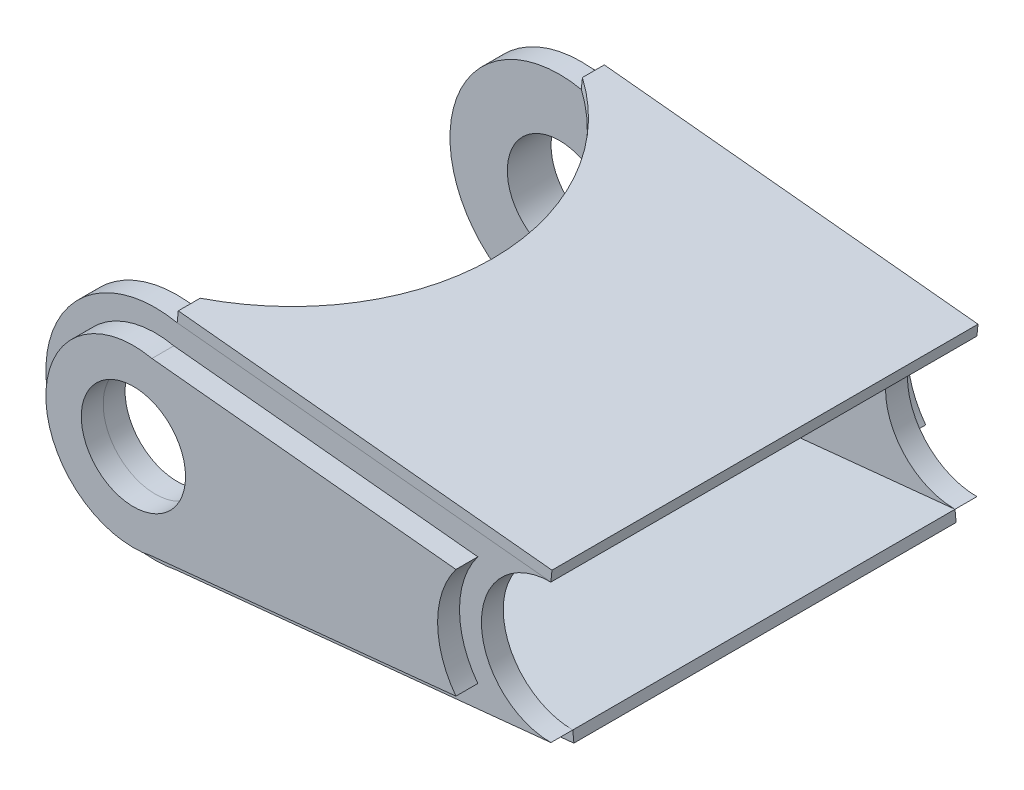
ISO-10303-21;
HEADER;
FILE_DESCRIPTION(('STEP AP214'),'2;1');
FILE_NAME('part.step','',(''),(''),'','','');
FILE_SCHEMA(('AUTOMOTIVE_DESIGN { 1 0 10303 214 1 1 1 1 }'));
ENDSEC;
DATA;
#1=APPLICATION_CONTEXT('core data for automotive mechanical design processes');
#2=APPLICATION_PROTOCOL_DEFINITION('international standard','automotive_design',2000,#1);
#3=PRODUCT_CONTEXT('',#1,'mechanical');
#4=PRODUCT('Part','Part','',(#3));
#5=PRODUCT_RELATED_PRODUCT_CATEGORY('part','',(#4));
#6=PRODUCT_DEFINITION_FORMATION('','',#4);
#7=PRODUCT_DEFINITION_CONTEXT('part definition',#1,'design');
#8=PRODUCT_DEFINITION('design','',#6,#7);
#9=PRODUCT_DEFINITION_SHAPE('','',#8);
#10=(LENGTH_UNIT() NAMED_UNIT(*) SI_UNIT(.MILLI.,.METRE.));
#11=(NAMED_UNIT(*) PLANE_ANGLE_UNIT() SI_UNIT($,.RADIAN.));
#12=(NAMED_UNIT(*) SI_UNIT($,.STERADIAN.) SOLID_ANGLE_UNIT());
#13=UNCERTAINTY_MEASURE_WITH_UNIT(LENGTH_MEASURE(1.E-05),#10,'distance_accuracy_value','');
#14=(GEOMETRIC_REPRESENTATION_CONTEXT(3) GLOBAL_UNCERTAINTY_ASSIGNED_CONTEXT((#13)) GLOBAL_UNIT_ASSIGNED_CONTEXT((#10,
#11,#12)) REPRESENTATION_CONTEXT('',''));
#15=CARTESIAN_POINT('',(0.,0.,0.));
#16=DIRECTION('',(0.,0.,1.));
#17=DIRECTION('',(1.,0.,0.));
#18=AXIS2_PLACEMENT_3D('',#15,#16,#17);
#19=CARTESIAN_POINT('',(-91.2989739584513,-23.9300487696169,0.));
#20=DIRECTION('',(-0.100474520026306,0.994939631749326,0.));
#21=DIRECTION('',(-0.994939631749326,-0.100474520026306,0.));
#22=AXIS2_PLACEMENT_3D('',#19,#20,#21);
#23=CYLINDRICAL_SURFACE('',#22,42.);
#24=CARTESIAN_POINT('',(-91.4999229985039,-21.9401695061182,0.));
#25=DIRECTION('',(-0.100474520026306,0.994939631749326,0.));
#26=DIRECTION('',(-0.994939631749326,-0.100474520026306,0.));
#27=AXIS2_PLACEMENT_3D('',#24,#25,#26);
#28=CIRCLE('',#27,42.);
#29=CARTESIAN_POINT('',(-68.2889308238494,-19.5961948330193,34.925));
#30=VERTEX_POINT('',#29);
#31=CARTESIAN_POINT('',(-68.2889308238494,-19.5961948330193,-34.925));
#32=VERTEX_POINT('',#31);
#33=EDGE_CURVE('E111',#30,#32,#28,.T.);
#34=ORIENTED_EDGE('',*,*,#33,.T.);
#35=DIRECTION('',(-0.100474520026306,0.994939631749326,0.));
#36=VECTOR('',#35,1.);
#37=CARTESIAN_POINT('',(-68.0879817837968,-21.586074096518,-34.925));
#38=LINE('',#37,#36);
#39=CARTESIAN_POINT('',(-68.0879817837968,-21.586074096518,-34.925));
#40=VERTEX_POINT('',#39);
#41=EDGE_CURVE('E12',#40,#32,#38,.T.);
#42=ORIENTED_EDGE('',*,*,#41,.F.);
#43=CARTESIAN_POINT('',(-91.2989739584513,-23.9300487696169,0.));
#44=DIRECTION('',(-0.100474520026306,0.994939631749326,0.));
#45=DIRECTION('',(-0.994939631749326,-0.100474520026306,0.));
#46=AXIS2_PLACEMENT_3D('',#43,#44,#45);
#47=CIRCLE('',#46,42.);
#48=CARTESIAN_POINT('',(-68.0879817837968,-21.586074096518,34.925));
#49=VERTEX_POINT('',#48);
#50=EDGE_CURVE('E99',#49,#40,#47,.T.);
#51=ORIENTED_EDGE('',*,*,#50,.F.);
#52=DIRECTION('',(-0.100474520026306,0.994939631749326,0.));
#53=VECTOR('',#52,1.);
#54=CARTESIAN_POINT('',(-68.0879817837968,-21.586074096518,34.925));
#55=LINE('',#54,#53);
#56=EDGE_CURVE('E107',#49,#30,#55,.T.);
#57=ORIENTED_EDGE('',*,*,#56,.T.);
#58=EDGE_LOOP('',(#34,#42,#51,#57));
#59=FACE_BOUND('',#58,.T.);
#60=ADVANCED_FACE('F48',(#59),#23,.F.);
#61=CARTESIAN_POINT('',(-68.0879817837968,-21.586074096518,-34.925));
#62=DIRECTION('',(0.,0.,1.));
#63=DIRECTION('',(1.,0.,0.));
#64=AXIS2_PLACEMENT_3D('',#61,#62,#63);
#65=PLANE('',#64);
#66=DIRECTION('',(0.994939631749325,0.100474520026306,0.));
#67=VECTOR('',#66,1.);
#68=CARTESIAN_POINT('',(-68.2889308238494,-19.5961948330193,-34.925));
#69=LINE('',#68,#67);
#70=CARTESIAN_POINT('',(0.,-12.7,-34.925));
#71=VERTEX_POINT('',#70);
#72=EDGE_CURVE('E103',#32,#71,#69,.T.);
#73=ORIENTED_EDGE('',*,*,#72,.T.);
#74=DIRECTION('',(-0.100474520026306,0.994939631749326,0.));
#75=VECTOR('',#74,1.);
#76=CARTESIAN_POINT('',(0.200949040052612,-14.6898792634987,-34.925));
#77=LINE('',#76,#75);
#78=CARTESIAN_POINT('',(0.200949040052612,-14.6898792634987,-34.925));
#79=VERTEX_POINT('',#78);
#80=EDGE_CURVE('E56',#79,#71,#77,.T.);
#81=ORIENTED_EDGE('',*,*,#80,.F.);
#82=DIRECTION('',(0.994939631749325,0.100474520026306,0.));
#83=VECTOR('',#82,1.);
#84=CARTESIAN_POINT('',(-68.0879817837968,-21.586074096518,-34.925));
#85=LINE('',#84,#83);
#86=EDGE_CURVE('E94',#40,#79,#85,.T.);
#87=ORIENTED_EDGE('',*,*,#86,.F.);
#88=ORIENTED_EDGE('',*,*,#41,.T.);
#89=EDGE_LOOP('',(#73,#81,#87,#88));
#90=FACE_BOUND('',#89,.T.);
#91=ADVANCED_FACE('F102',(#90),#65,.F.);
#92=CARTESIAN_POINT('',(0.200949040052612,-14.6898792634987,-34.925));
#93=DIRECTION('',(-0.994939631749326,-0.100474520026306,0.));
#94=DIRECTION('',(0.100474520026306,-0.994939631749326,0.));
#95=AXIS2_PLACEMENT_3D('',#92,#93,#94);
#96=PLANE('',#95);
#97=DIRECTION('',(0.,0.,1.));
#98=VECTOR('',#97,1.);
#99=CARTESIAN_POINT('',(0.,-12.7,-34.925));
#100=LINE('',#99,#98);
#101=CARTESIAN_POINT('',(0.,-12.7,34.925));
#102=VERTEX_POINT('',#101);
#103=EDGE_CURVE('E81',#71,#102,#100,.T.);
#104=ORIENTED_EDGE('',*,*,#103,.T.);
#105=DIRECTION('',(-0.100474520026306,0.994939631749326,0.));
#106=VECTOR('',#105,1.);
#107=CARTESIAN_POINT('',(0.200949040052612,-14.6898792634987,34.925));
#108=LINE('',#107,#106);
#109=CARTESIAN_POINT('',(0.200949040052612,-14.6898792634987,34.925));
#110=VERTEX_POINT('',#109);
#111=EDGE_CURVE('E104',#110,#102,#108,.T.);
#112=ORIENTED_EDGE('',*,*,#111,.F.);
#113=DIRECTION('',(0.,0.,1.));
#114=VECTOR('',#113,1.);
#115=CARTESIAN_POINT('',(0.200949040052612,-14.6898792634987,-34.925));
#116=LINE('',#115,#114);
#117=EDGE_CURVE('E97',#79,#110,#116,.T.);
#118=ORIENTED_EDGE('',*,*,#117,.F.);
#119=ORIENTED_EDGE('',*,*,#80,.T.);
#120=EDGE_LOOP('',(#104,#112,#118,#119));
#121=FACE_BOUND('',#120,.T.);
#122=ADVANCED_FACE('F105',(#121),#96,.F.);
#123=CARTESIAN_POINT('',(-68.0879817837968,-21.586074096518,34.925));
#124=DIRECTION('',(0.,0.,-1.));
#125=DIRECTION('',(-1.,0.,0.));
#126=AXIS2_PLACEMENT_3D('',#123,#124,#125);
#127=PLANE('',#126);
#128=DIRECTION('',(-0.994939631749325,-0.100474520026306,0.));
#129=VECTOR('',#128,1.);
#130=CARTESIAN_POINT('',(-68.2889308238494,-19.5961948330193,34.925));
#131=LINE('',#130,#129);
#132=EDGE_CURVE('E87',#102,#30,#131,.T.);
#133=ORIENTED_EDGE('',*,*,#132,.T.);
#134=ORIENTED_EDGE('',*,*,#56,.F.);
#135=DIRECTION('',(-0.994939631749325,-0.100474520026306,0.));
#136=VECTOR('',#135,1.);
#137=CARTESIAN_POINT('',(-68.0879817837968,-21.586074096518,34.925));
#138=LINE('',#137,#136);
#139=EDGE_CURVE('E64',#110,#49,#138,.T.);
#140=ORIENTED_EDGE('',*,*,#139,.F.);
#141=ORIENTED_EDGE('',*,*,#111,.T.);
#142=EDGE_LOOP('',(#133,#134,#140,#141));
#143=FACE_BOUND('',#142,.T.);
#144=ADVANCED_FACE('F118',(#143),#127,.F.);
#145=CARTESIAN_POINT('',(-91.2989739584513,-23.9300487696169,0.));
#146=DIRECTION('',(-0.100474520026306,0.994939631749326,0.));
#147=DIRECTION('',(-0.994939631749326,-0.100474520026306,0.));
#148=AXIS2_PLACEMENT_3D('',#145,#146,#147);
#149=PLANE('',#148);
#150=ORIENTED_EDGE('',*,*,#50,.T.);
#151=ORIENTED_EDGE('',*,*,#86,.T.);
#152=ORIENTED_EDGE('',*,*,#117,.T.);
#153=ORIENTED_EDGE('',*,*,#139,.T.);
#154=EDGE_LOOP('',(#150,#151,#152,#153));
#155=FACE_BOUND('',#154,.T.);
#156=ADVANCED_FACE('F95',(#155),#149,.F.);
#157=CARTESIAN_POINT('',(-91.4999229985039,-21.9401695061182,0.));
#158=DIRECTION('',(-0.100474520026306,0.994939631749326,0.));
#159=DIRECTION('',(-0.994939631749326,-0.100474520026306,0.));
#160=AXIS2_PLACEMENT_3D('',#157,#158,#159);
#161=PLANE('',#160);
#162=ORIENTED_EDGE('',*,*,#33,.F.);
#163=ORIENTED_EDGE('',*,*,#132,.F.);
#164=ORIENTED_EDGE('',*,*,#103,.F.);
#165=ORIENTED_EDGE('',*,*,#72,.F.);
#166=EDGE_LOOP('',(#162,#163,#164,#165));
#167=FACE_BOUND('',#166,.T.);
#168=ADVANCED_FACE('F121',(#167),#161,.T.);
#169=CLOSED_SHELL('',(#60,#91,#122,#144,#156,#168));
#170=MANIFOLD_SOLID_BREP('B2',#169);
#171=CARTESIAN_POINT('',(-91.2989739584513,23.9300487696169,0.));
#172=DIRECTION('',(-0.100474520026306,-0.994939631749326,0.));
#173=DIRECTION('',(0.994939631749326,-0.100474520026306,0.));
#174=AXIS2_PLACEMENT_3D('',#171,#172,#173);
#175=CYLINDRICAL_SURFACE('',#174,42.);
#176=CARTESIAN_POINT('',(-91.4999229985039,21.9401695061182,0.));
#177=DIRECTION('',(-0.100474520026306,-0.994939631749326,0.));
#178=DIRECTION('',(0.994939631749326,-0.100474520026306,0.));
#179=AXIS2_PLACEMENT_3D('',#176,#177,#178);
#180=CIRCLE('',#179,42.);
#181=CARTESIAN_POINT('',(-68.2889308238494,19.5961948330193,-34.925));
#182=VERTEX_POINT('',#181);
#183=CARTESIAN_POINT('',(-68.2889308238494,19.5961948330193,34.925));
#184=VERTEX_POINT('',#183);
#185=EDGE_CURVE('E266',#182,#184,#180,.T.);
#186=ORIENTED_EDGE('',*,*,#185,.T.);
#187=DIRECTION('',(-0.100474520026306,-0.994939631749326,0.));
#188=VECTOR('',#187,1.);
#189=CARTESIAN_POINT('',(-68.0879817837968,21.586074096518,34.925));
#190=LINE('',#189,#188);
#191=CARTESIAN_POINT('',(-68.0879817837968,21.586074096518,34.925));
#192=VERTEX_POINT('',#191);
#193=EDGE_CURVE('E46',#192,#184,#190,.T.);
#194=ORIENTED_EDGE('',*,*,#193,.F.);
#195=CARTESIAN_POINT('',(-91.2989739584513,23.9300487696169,0.));
#196=DIRECTION('',(-0.100474520026306,-0.994939631749326,0.));
#197=DIRECTION('',(0.994939631749326,-0.100474520026306,0.));
#198=AXIS2_PLACEMENT_3D('',#195,#196,#197);
#199=CIRCLE('',#198,42.);
#200=CARTESIAN_POINT('',(-68.0879817837968,21.586074096518,-34.925));
#201=VERTEX_POINT('',#200);
#202=EDGE_CURVE('E276',#201,#192,#199,.T.);
#203=ORIENTED_EDGE('',*,*,#202,.F.);
#204=DIRECTION('',(-0.100474520026306,-0.994939631749326,0.));
#205=VECTOR('',#204,1.);
#206=CARTESIAN_POINT('',(-68.0879817837968,21.586074096518,-34.925));
#207=LINE('',#206,#205);
#208=EDGE_CURVE('E262',#201,#182,#207,.T.);
#209=ORIENTED_EDGE('',*,*,#208,.T.);
#210=EDGE_LOOP('',(#186,#194,#203,#209));
#211=FACE_BOUND('',#210,.T.);
#212=ADVANCED_FACE('F182',(#211),#175,.F.);
#213=CARTESIAN_POINT('',(-68.0879817837968,21.586074096518,34.925));
#214=DIRECTION('',(0.994939631749326,-0.100474520026306,0.));
#215=DIRECTION('',(0.100474520026306,0.994939631749326,0.));
#216=AXIS2_PLACEMENT_3D('',#213,#214,#215);
#217=PLANE('',#216);
#218=DIRECTION('',(0.,0.,1.));
#219=VECTOR('',#218,1.);
#220=CARTESIAN_POINT('',(-68.2889308238494,19.5961948330193,34.925));
#221=LINE('',#220,#219);
#222=CARTESIAN_POINT('',(-68.2889308238494,19.5961948330193,38.925));
#223=VERTEX_POINT('',#222);
#224=EDGE_CURVE('E269',#184,#223,#221,.T.);
#225=ORIENTED_EDGE('',*,*,#224,.T.);
#226=DIRECTION('',(-0.100474520026306,-0.994939631749326,0.));
#227=VECTOR('',#226,1.);
#228=CARTESIAN_POINT('',(-68.0879817837968,21.586074096518,38.925));
#229=LINE('',#228,#227);
#230=CARTESIAN_POINT('',(-68.0879817837968,21.586074096518,38.925));
#231=VERTEX_POINT('',#230);
#232=EDGE_CURVE('E190',#231,#223,#229,.T.);
#233=ORIENTED_EDGE('',*,*,#232,.F.);
#234=DIRECTION('',(0.,0.,1.));
#235=VECTOR('',#234,1.);
#236=CARTESIAN_POINT('',(-68.0879817837968,21.586074096518,34.925));
#237=LINE('',#236,#235);
#238=EDGE_CURVE('E235',#192,#231,#237,.T.);
#239=ORIENTED_EDGE('',*,*,#238,.F.);
#240=ORIENTED_EDGE('',*,*,#193,.T.);
#241=EDGE_LOOP('',(#225,#233,#239,#240));
#242=FACE_BOUND('',#241,.T.);
#243=ADVANCED_FACE('F300',(#242),#217,.F.);
#244=CARTESIAN_POINT('',(-68.0879817837968,21.586074096518,38.925));
#245=DIRECTION('',(0.,0.,-1.));
#246=DIRECTION('',(-1.,0.,0.));
#247=AXIS2_PLACEMENT_3D('',#244,#245,#246);
#248=PLANE('',#247);
#249=DIRECTION('',(0.994939631749325,-0.100474520026306,0.));
#250=VECTOR('',#249,1.);
#251=CARTESIAN_POINT('',(-68.2889308238494,19.5961948330193,38.925));
#252=LINE('',#251,#250);
#253=CARTESIAN_POINT('',(0.,12.7,38.925));
#254=VERTEX_POINT('',#253);
#255=EDGE_CURVE('E271',#223,#254,#252,.T.);
#256=ORIENTED_EDGE('',*,*,#255,.T.);
#257=DIRECTION('',(-0.100474520026306,-0.994939631749326,0.));
#258=VECTOR('',#257,1.);
#259=CARTESIAN_POINT('',(0.200949040052612,14.6898792634987,38.925));
#260=LINE('',#259,#258);
#261=CARTESIAN_POINT('',(0.200949040052612,14.6898792634987,38.925));
#262=VERTEX_POINT('',#261);
#263=EDGE_CURVE('E257',#262,#254,#260,.T.);
#264=ORIENTED_EDGE('',*,*,#263,.F.);
#265=DIRECTION('',(0.994939631749325,-0.100474520026306,0.));
#266=VECTOR('',#265,1.);
#267=CARTESIAN_POINT('',(-68.0879817837968,21.586074096518,38.925));
#268=LINE('',#267,#266);
#269=EDGE_CURVE('E248',#231,#262,#268,.T.);
#270=ORIENTED_EDGE('',*,*,#269,.F.);
#271=ORIENTED_EDGE('',*,*,#232,.T.);
#272=EDGE_LOOP('',(#256,#264,#270,#271));
#273=FACE_BOUND('',#272,.T.);
#274=ADVANCED_FACE('F282',(#273),#248,.F.);
#275=CARTESIAN_POINT('',(0.200949040052612,14.6898792634987,38.925));
#276=DIRECTION('',(-0.994939631749326,0.100474520026306,0.));
#277=DIRECTION('',(-0.100474520026306,-0.994939631749326,0.));
#278=AXIS2_PLACEMENT_3D('',#275,#276,#277);
#279=PLANE('',#278);
#280=DIRECTION('',(0.,0.,-1.));
#281=VECTOR('',#280,1.);
#282=CARTESIAN_POINT('',(0.,12.7,38.925));
#283=LINE('',#282,#281);
#284=CARTESIAN_POINT('',(0.,12.7,-38.925));
#285=VERTEX_POINT('',#284);
#286=EDGE_CURVE('E256',#254,#285,#283,.T.);
#287=ORIENTED_EDGE('',*,*,#286,.T.);
#288=DIRECTION('',(-0.100474520026306,-0.994939631749326,0.));
#289=VECTOR('',#288,1.);
#290=CARTESIAN_POINT('',(0.200949040052612,14.6898792634987,-38.925));
#291=LINE('',#290,#289);
#292=CARTESIAN_POINT('',(0.200949040052612,14.6898792634987,-38.925));
#293=VERTEX_POINT('',#292);
#294=EDGE_CURVE('E253',#293,#285,#291,.T.);
#295=ORIENTED_EDGE('',*,*,#294,.F.);
#296=DIRECTION('',(0.,0.,-1.));
#297=VECTOR('',#296,1.);
#298=CARTESIAN_POINT('',(0.200949040052612,14.6898792634987,38.925));
#299=LINE('',#298,#297);
#300=EDGE_CURVE('E242',#262,#293,#299,.T.);
#301=ORIENTED_EDGE('',*,*,#300,.F.);
#302=ORIENTED_EDGE('',*,*,#263,.T.);
#303=EDGE_LOOP('',(#287,#295,#301,#302));
#304=FACE_BOUND('',#303,.T.);
#305=ADVANCED_FACE('F254',(#304),#279,.F.);
#306=CARTESIAN_POINT('',(-68.0879817837968,21.586074096518,-38.925));
#307=DIRECTION('',(0.,0.,1.));
#308=DIRECTION('',(1.,0.,0.));
#309=AXIS2_PLACEMENT_3D('',#306,#307,#308);
#310=PLANE('',#309);
#311=DIRECTION('',(-0.994939631749325,0.100474520026306,0.));
#312=VECTOR('',#311,1.);
#313=CARTESIAN_POINT('',(-68.2889308238494,19.5961948330193,-38.925));
#314=LINE('',#313,#312);
#315=CARTESIAN_POINT('',(-68.2889308238494,19.5961948330193,-38.925));
#316=VERTEX_POINT('',#315);
#317=EDGE_CURVE('E221',#285,#316,#314,.T.);
#318=ORIENTED_EDGE('',*,*,#317,.T.);
#319=DIRECTION('',(-0.100474520026306,-0.994939631749326,0.));
#320=VECTOR('',#319,1.);
#321=CARTESIAN_POINT('',(-68.0879817837968,21.586074096518,-38.925));
#322=LINE('',#321,#320);
#323=CARTESIAN_POINT('',(-68.0879817837968,21.586074096518,-38.925));
#324=VERTEX_POINT('',#323);
#325=EDGE_CURVE('E258',#324,#316,#322,.T.);
#326=ORIENTED_EDGE('',*,*,#325,.F.);
#327=DIRECTION('',(-0.994939631749325,0.100474520026306,0.));
#328=VECTOR('',#327,1.);
#329=CARTESIAN_POINT('',(-68.0879817837968,21.586074096518,-38.925));
#330=LINE('',#329,#328);
#331=EDGE_CURVE('E246',#293,#324,#330,.T.);
#332=ORIENTED_EDGE('',*,*,#331,.F.);
#333=ORIENTED_EDGE('',*,*,#294,.T.);
#334=EDGE_LOOP('',(#318,#326,#332,#333));
#335=FACE_BOUND('',#334,.T.);
#336=ADVANCED_FACE('F260',(#335),#310,.F.);
#337=CARTESIAN_POINT('',(-68.0879817837968,21.586074096518,-38.925));
#338=DIRECTION('',(0.994939631749326,-0.100474520026306,0.));
#339=DIRECTION('',(0.100474520026306,0.994939631749326,0.));
#340=AXIS2_PLACEMENT_3D('',#337,#338,#339);
#341=PLANE('',#340);
#342=DIRECTION('',(0.,0.,1.));
#343=VECTOR('',#342,1.);
#344=CARTESIAN_POINT('',(-68.2889308238494,19.5961948330193,-38.925));
#345=LINE('',#344,#343);
#346=EDGE_CURVE('E227',#316,#182,#345,.T.);
#347=ORIENTED_EDGE('',*,*,#346,.T.);
#348=ORIENTED_EDGE('',*,*,#208,.F.);
#349=DIRECTION('',(0.,0.,1.));
#350=VECTOR('',#349,1.);
#351=CARTESIAN_POINT('',(-68.0879817837968,21.586074096518,-38.925));
#352=LINE('',#351,#350);
#353=EDGE_CURVE('E198',#324,#201,#352,.T.);
#354=ORIENTED_EDGE('',*,*,#353,.F.);
#355=ORIENTED_EDGE('',*,*,#325,.T.);
#356=EDGE_LOOP('',(#347,#348,#354,#355));
#357=FACE_BOUND('',#356,.T.);
#358=ADVANCED_FACE('F289',(#357),#341,.F.);
#359=CARTESIAN_POINT('',(-91.2989739584513,23.9300487696169,0.));
#360=DIRECTION('',(-0.100474520026306,-0.994939631749326,0.));
#361=DIRECTION('',(0.994939631749326,-0.100474520026306,0.));
#362=AXIS2_PLACEMENT_3D('',#359,#360,#361);
#363=PLANE('',#362);
#364=ORIENTED_EDGE('',*,*,#202,.T.);
#365=ORIENTED_EDGE('',*,*,#238,.T.);
#366=ORIENTED_EDGE('',*,*,#269,.T.);
#367=ORIENTED_EDGE('',*,*,#300,.T.);
#368=ORIENTED_EDGE('',*,*,#331,.T.);
#369=ORIENTED_EDGE('',*,*,#353,.T.);
#370=EDGE_LOOP('',(#364,#365,#366,#367,#368,#369));
#371=FACE_BOUND('',#370,.T.);
#372=ADVANCED_FACE('F244',(#371),#363,.F.);
#373=CARTESIAN_POINT('',(-91.4999229985039,21.9401695061182,0.));
#374=DIRECTION('',(-0.100474520026306,-0.994939631749326,0.));
#375=DIRECTION('',(0.994939631749326,-0.100474520026306,0.));
#376=AXIS2_PLACEMENT_3D('',#373,#374,#375);
#377=PLANE('',#376);
#378=ORIENTED_EDGE('',*,*,#185,.F.);
#379=ORIENTED_EDGE('',*,*,#346,.F.);
#380=ORIENTED_EDGE('',*,*,#317,.F.);
#381=ORIENTED_EDGE('',*,*,#286,.F.);
#382=ORIENTED_EDGE('',*,*,#255,.F.);
#383=ORIENTED_EDGE('',*,*,#224,.F.);
#384=EDGE_LOOP('',(#378,#379,#380,#381,#382,#383));
#385=FACE_BOUND('',#384,.T.);
#386=ADVANCED_FACE('F285',(#385),#377,.T.);
#387=CLOSED_SHELL('',(#212,#243,#274,#305,#336,#358,#372,#386));
#388=MANIFOLD_SOLID_BREP('B6',#387);
#389=CARTESIAN_POINT('',(0.,0.,42.925));
#390=DIRECTION('',(0.,0.,-1.));
#391=DIRECTION('',(-1.,0.,0.));
#392=AXIS2_PLACEMENT_3D('',#389,#390,#391);
#393=CYLINDRICAL_SURFACE('',#392,16.7);
#394=CARTESIAN_POINT('',(0.,0.,38.925));
#395=DIRECTION('',(0.,0.,-1.));
#396=DIRECTION('',(1.,0.,0.));
#397=AXIS2_PLACEMENT_3D('',#394,#395,#396);
#398=CIRCLE('',#397,16.7);
#399=CARTESIAN_POINT('',(-13.3538453771817,-10.0282009175287,38.925));
#400=VERTEX_POINT('',#399);
#401=CARTESIAN_POINT('',(-13.3538453771817,10.0282009175287,38.925));
#402=VERTEX_POINT('',#401);
#403=EDGE_CURVE('E433',#400,#402,#398,.T.);
#404=ORIENTED_EDGE('',*,*,#403,.T.);
#405=DIRECTION('',(0.,0.,-1.));
#406=VECTOR('',#405,1.);
#407=CARTESIAN_POINT('',(-13.3538453771817,10.0282009175287,42.925));
#408=LINE('',#407,#406);
#409=CARTESIAN_POINT('',(-13.3538453771817,10.0282009175287,42.925));
#410=VERTEX_POINT('',#409);
#411=EDGE_CURVE('E180',#410,#402,#408,.T.);
#412=ORIENTED_EDGE('',*,*,#411,.F.);
#413=CARTESIAN_POINT('',(0.,0.,42.925));
#414=DIRECTION('',(0.,0.,-1.));
#415=DIRECTION('',(1.,0.,0.));
#416=AXIS2_PLACEMENT_3D('',#413,#414,#415);
#417=CIRCLE('',#416,16.7);
#418=CARTESIAN_POINT('',(-13.3538453771817,-10.0282009175287,42.925));
#419=VERTEX_POINT('',#418);
#420=EDGE_CURVE('E420',#419,#410,#417,.T.);
#421=ORIENTED_EDGE('',*,*,#420,.F.);
#422=DIRECTION('',(0.,0.,-1.));
#423=VECTOR('',#422,1.);
#424=CARTESIAN_POINT('',(-13.3538453771817,-10.0282009175287,42.925));
#425=LINE('',#424,#423);
#426=EDGE_CURVE('E429',#419,#400,#425,.T.);
#427=ORIENTED_EDGE('',*,*,#426,.T.);
#428=EDGE_LOOP('',(#404,#412,#421,#427));
#429=FACE_BOUND('',#428,.T.);
#430=ADVANCED_FACE('F368',(#429),#393,.F.);
#431=CARTESIAN_POINT('',(-13.3538453771817,10.0282009175287,42.925));
#432=DIRECTION('',(-0.100474520026306,-0.994939631749326,0.));
#433=DIRECTION('',(0.994939631749326,-0.100474520026306,0.));
#434=AXIS2_PLACEMENT_3D('',#431,#432,#433);
#435=PLANE('',#434);
#436=DIRECTION('',(-0.994939631749326,0.100474520026306,0.));
#437=VECTOR('',#436,1.);
#438=CARTESIAN_POINT('',(-13.3538453771817,10.0282009175287,38.925));
#439=LINE('',#438,#437);
#440=CARTESIAN_POINT('',(-68.9024700045208,15.6378089977097,38.925));
#441=VERTEX_POINT('',#440);
#442=EDGE_CURVE('E424',#402,#441,#439,.T.);
#443=ORIENTED_EDGE('',*,*,#442,.T.);
#444=DIRECTION('',(0.,0.,-1.));
#445=VECTOR('',#444,1.);
#446=CARTESIAN_POINT('',(-68.9024700045208,15.6378089977097,42.925));
#447=LINE('',#446,#445);
#448=CARTESIAN_POINT('',(-68.9024700045208,15.6378089977097,42.925));
#449=VERTEX_POINT('',#448);
#450=EDGE_CURVE('E377',#449,#441,#447,.T.);
#451=ORIENTED_EDGE('',*,*,#450,.F.);
#452=DIRECTION('',(-0.994939631749326,0.100474520026306,0.));
#453=VECTOR('',#452,1.);
#454=CARTESIAN_POINT('',(-13.3538453771817,10.0282009175287,42.925));
#455=LINE('',#454,#453);
#456=EDGE_CURVE('E415',#410,#449,#455,.T.);
#457=ORIENTED_EDGE('',*,*,#456,.F.);
#458=ORIENTED_EDGE('',*,*,#411,.T.);
#459=EDGE_LOOP('',(#443,#451,#457,#458));
#460=FACE_BOUND('',#459,.T.);
#461=ADVANCED_FACE('F423',(#460),#435,.F.);
#462=CARTESIAN_POINT('',(-72.2875741020559,0.,42.925));
#463=DIRECTION('',(0.,0.,-1.));
#464=DIRECTION('',(-1.,0.,0.));
#465=AXIS2_PLACEMENT_3D('',#462,#463,#464);
#466=CYLINDRICAL_SURFACE('',#465,16.);
#467=CARTESIAN_POINT('',(-72.2875741020559,0.,38.925));
#468=DIRECTION('',(0.,0.,1.));
#469=DIRECTION('',(1.,0.,0.));
#470=AXIS2_PLACEMENT_3D('',#467,#468,#469);
#471=CIRCLE('',#470,16.);
#472=CARTESIAN_POINT('',(-68.9024700045208,-15.6378089977097,38.925));
#473=VERTEX_POINT('',#472);
#474=EDGE_CURVE('E402',#441,#473,#471,.T.);
#475=ORIENTED_EDGE('',*,*,#474,.T.);
#476=DIRECTION('',(0.,0.,-1.));
#477=VECTOR('',#476,1.);
#478=CARTESIAN_POINT('',(-68.9024700045208,-15.6378089977097,42.925));
#479=LINE('',#478,#477);
#480=CARTESIAN_POINT('',(-68.9024700045208,-15.6378089977097,42.925));
#481=VERTEX_POINT('',#480);
#482=EDGE_CURVE('E425',#481,#473,#479,.T.);
#483=ORIENTED_EDGE('',*,*,#482,.F.);
#484=CARTESIAN_POINT('',(-72.2875741020559,0.,42.925));
#485=DIRECTION('',(0.,0.,1.));
#486=DIRECTION('',(1.,0.,0.));
#487=AXIS2_PLACEMENT_3D('',#484,#485,#486);
#488=CIRCLE('',#487,16.);
#489=EDGE_CURVE('E418',#449,#481,#488,.T.);
#490=ORIENTED_EDGE('',*,*,#489,.F.);
#491=ORIENTED_EDGE('',*,*,#450,.T.);
#492=EDGE_LOOP('',(#475,#483,#490,#491));
#493=FACE_BOUND('',#492,.T.);
#494=ADVANCED_FACE('F427',(#493),#466,.T.);
#495=CARTESIAN_POINT('',(-68.9024700045208,-15.6378089977097,42.925));
#496=DIRECTION('',(-0.100474520026306,0.994939631749326,0.));
#497=DIRECTION('',(-0.994939631749326,-0.100474520026306,0.));
#498=AXIS2_PLACEMENT_3D('',#495,#496,#497);
#499=PLANE('',#498);
#500=DIRECTION('',(0.994939631749326,0.100474520026306,0.));
#501=VECTOR('',#500,1.);
#502=CARTESIAN_POINT('',(-68.9024700045208,-15.6378089977097,38.925));
#503=LINE('',#502,#501);
#504=EDGE_CURVE('E408',#473,#400,#503,.T.);
#505=ORIENTED_EDGE('',*,*,#504,.T.);
#506=ORIENTED_EDGE('',*,*,#426,.F.);
#507=DIRECTION('',(0.994939631749326,0.100474520026306,0.));
#508=VECTOR('',#507,1.);
#509=CARTESIAN_POINT('',(-68.9024700045208,-15.6378089977097,42.925));
#510=LINE('',#509,#508);
#511=EDGE_CURVE('E385',#481,#419,#510,.T.);
#512=ORIENTED_EDGE('',*,*,#511,.F.);
#513=ORIENTED_EDGE('',*,*,#482,.T.);
#514=EDGE_LOOP('',(#505,#506,#512,#513));
#515=FACE_BOUND('',#514,.T.);
#516=ADVANCED_FACE('F440',(#515),#499,.F.);
#517=CARTESIAN_POINT('',(0.,0.,42.925));
#518=DIRECTION('',(0.,0.,1.));
#519=DIRECTION('',(1.,0.,0.));
#520=AXIS2_PLACEMENT_3D('',#517,#518,#519);
#521=PLANE('',#520);
#522=CARTESIAN_POINT('',(-72.2875741020559,0.,42.925));
#523=DIRECTION('',(0.,0.,1.));
#524=DIRECTION('',(1.,0.,0.));
#525=AXIS2_PLACEMENT_3D('',#522,#523,#524);
#526=CIRCLE('',#525,9.52500000000001);
#527=CARTESIAN_POINT('',(-62.7625741020559,0.,42.925));
#528=VERTEX_POINT('',#527);
#529=EDGE_CURVE('E446',#528,#528,#526,.T.);
#530=ORIENTED_EDGE('',*,*,#529,.F.);
#531=EDGE_LOOP('',(#530));
#532=FACE_BOUND('',#531,.T.);
#533=ORIENTED_EDGE('',*,*,#420,.T.);
#534=ORIENTED_EDGE('',*,*,#456,.T.);
#535=ORIENTED_EDGE('',*,*,#489,.T.);
#536=ORIENTED_EDGE('',*,*,#511,.T.);
#537=EDGE_LOOP('',(#533,#534,#535,#536));
#538=FACE_BOUND('',#537,.T.);
#539=ADVANCED_FACE('F416',(#532,#538),#521,.T.);
#540=CARTESIAN_POINT('',(0.,0.,38.925));
#541=DIRECTION('',(0.,0.,1.));
#542=DIRECTION('',(1.,0.,0.));
#543=AXIS2_PLACEMENT_3D('',#540,#541,#542);
#544=PLANE('',#543);
#545=CARTESIAN_POINT('',(-72.2875741020559,0.,38.925));
#546=DIRECTION('',(0.,0.,1.));
#547=DIRECTION('',(1.,0.,0.));
#548=AXIS2_PLACEMENT_3D('',#545,#546,#547);
#549=CIRCLE('',#548,9.52500000000001);
#550=CARTESIAN_POINT('',(-62.7625741020559,0.,38.925));
#551=VERTEX_POINT('',#550);
#552=EDGE_CURVE('E371',#551,#551,#549,.T.);
#553=ORIENTED_EDGE('',*,*,#552,.T.);
#554=EDGE_LOOP('',(#553));
#555=FACE_BOUND('',#554,.T.);
#556=ORIENTED_EDGE('',*,*,#403,.F.);
#557=ORIENTED_EDGE('',*,*,#504,.F.);
#558=ORIENTED_EDGE('',*,*,#474,.F.);
#559=ORIENTED_EDGE('',*,*,#442,.F.);
#560=EDGE_LOOP('',(#556,#557,#558,#559));
#561=FACE_BOUND('',#560,.T.);
#562=ADVANCED_FACE('F443',(#555,#561),#544,.F.);
#563=CARTESIAN_POINT('',(-72.2875741020559,0.,7.98423163679252));
#564=DIRECTION('',(0.,0.,1.));
#565=DIRECTION('',(1.,0.,0.));
#566=AXIS2_PLACEMENT_3D('',#563,#564,#565);
#567=CYLINDRICAL_SURFACE('',#566,9.52500000000001);
#568=ORIENTED_EDGE('',*,*,#529,.T.);
#569=EDGE_LOOP('',(#568));
#570=FACE_BOUND('',#569,.T.);
#571=ORIENTED_EDGE('',*,*,#552,.F.);
#572=EDGE_LOOP('',(#571));
#573=FACE_BOUND('',#572,.T.);
#574=ADVANCED_FACE('F454',(#570,#573),#567,.F.);
#575=CLOSED_SHELL('',(#430,#461,#494,#516,#539,#562,#574));
#576=MANIFOLD_SOLID_BREP('B40',#575);
#577=CARTESIAN_POINT('',(-72.2875741020559,0.,-38.925));
#578=DIRECTION('',(0.,0.,1.));
#579=DIRECTION('',(1.,0.,0.));
#580=AXIS2_PLACEMENT_3D('',#577,#578,#579);
#581=CYLINDRICAL_SURFACE('',#580,20.);
#582=CARTESIAN_POINT('',(-72.2875741020559,0.,-34.925));
#583=DIRECTION('',(0.,0.,1.));
#584=DIRECTION('',(1.,0.,0.));
#585=AXIS2_PLACEMENT_3D('',#582,#583,#584);
#586=CIRCLE('',#585,20.);
#587=CARTESIAN_POINT('',(-68.2889308238494,19.5961948330193,-34.925));
#588=VERTEX_POINT('',#587);
#589=CARTESIAN_POINT('',(-68.2889308238494,-19.5961948330193,-34.925));
#590=VERTEX_POINT('',#589);
#591=EDGE_CURVE('E640',#588,#590,#586,.T.);
#592=ORIENTED_EDGE('',*,*,#591,.F.);
#593=DIRECTION('',(0.,0.,1.));
#594=VECTOR('',#593,1.);
#595=CARTESIAN_POINT('',(-68.2889308238494,19.5961948330193,-38.925));
#596=LINE('',#595,#594);
#597=CARTESIAN_POINT('',(-68.2889308238494,19.5961948330193,-38.925));
#598=VERTEX_POINT('',#597);
#599=EDGE_CURVE('E366',#598,#588,#596,.T.);
#600=ORIENTED_EDGE('',*,*,#599,.F.);
#601=CARTESIAN_POINT('',(-72.2875741020559,0.,-38.925));
#602=DIRECTION('',(0.,0.,1.));
#603=DIRECTION('',(1.,0.,0.));
#604=AXIS2_PLACEMENT_3D('',#601,#602,#603);
#605=CIRCLE('',#604,20.);
#606=CARTESIAN_POINT('',(-68.2889308238494,-19.5961948330193,-38.925));
#607=VERTEX_POINT('',#606);
#608=EDGE_CURVE('E641',#598,#607,#605,.T.);
#609=ORIENTED_EDGE('',*,*,#608,.T.);
#610=DIRECTION('',(0.,0.,1.));
#611=VECTOR('',#610,1.);
#612=CARTESIAN_POINT('',(-68.2889308238494,-19.5961948330193,-38.925));
#613=LINE('',#612,#611);
#614=EDGE_CURVE('E525',#607,#590,#613,.T.);
#615=ORIENTED_EDGE('',*,*,#614,.T.);
#616=EDGE_LOOP('',(#592,#600,#609,#615));
#617=FACE_BOUND('',#616,.T.);
#618=ADVANCED_FACE('F522',(#617),#581,.T.);
#619=CARTESIAN_POINT('',(0.,12.7,-38.925));
#620=DIRECTION('',(0.100474520026306,0.994939631749326,0.));
#621=DIRECTION('',(-0.994939631749326,0.100474520026306,0.));
#622=AXIS2_PLACEMENT_3D('',#619,#620,#621);
#623=PLANE('',#622);
#624=DIRECTION('',(-0.994939631749326,0.100474520026306,0.));
#625=VECTOR('',#624,1.);
#626=CARTESIAN_POINT('',(0.,12.7,-34.925));
#627=LINE('',#626,#625);
#628=CARTESIAN_POINT('',(0.,12.7,-34.925));
#629=VERTEX_POINT('',#628);
#630=EDGE_CURVE('E644',#629,#588,#627,.T.);
#631=ORIENTED_EDGE('',*,*,#630,.F.);
#632=DIRECTION('',(0.,0.,1.));
#633=VECTOR('',#632,1.);
#634=CARTESIAN_POINT('',(0.,12.7,-38.925));
#635=LINE('',#634,#633);
#636=CARTESIAN_POINT('',(0.,12.7,-38.925));
#637=VERTEX_POINT('',#636);
#638=EDGE_CURVE('E530',#637,#629,#635,.T.);
#639=ORIENTED_EDGE('',*,*,#638,.F.);
#640=DIRECTION('',(-0.994939631749326,0.100474520026306,0.));
#641=VECTOR('',#640,1.);
#642=CARTESIAN_POINT('',(0.,12.7,-38.925));
#643=LINE('',#642,#641);
#644=EDGE_CURVE('E649',#637,#598,#643,.T.);
#645=ORIENTED_EDGE('',*,*,#644,.T.);
#646=ORIENTED_EDGE('',*,*,#599,.T.);
#647=EDGE_LOOP('',(#631,#639,#645,#646));
#648=FACE_BOUND('',#647,.T.);
#649=ADVANCED_FACE('F666',(#648),#623,.T.);
#650=CARTESIAN_POINT('',(0.,0.,-38.925));
#651=DIRECTION('',(0.,0.,1.));
#652=DIRECTION('',(1.,0.,0.));
#653=AXIS2_PLACEMENT_3D('',#650,#651,#652);
#654=CYLINDRICAL_SURFACE('',#653,12.7);
#655=CARTESIAN_POINT('',(0.,0.,-34.925));
#656=DIRECTION('',(0.,0.,-1.));
#657=DIRECTION('',(1.,0.,0.));
#658=AXIS2_PLACEMENT_3D('',#655,#656,#657);
#659=CIRCLE('',#658,12.7);
#660=CARTESIAN_POINT('',(0.,-12.7,-34.925));
#661=VERTEX_POINT('',#660);
#662=EDGE_CURVE('E656',#661,#629,#659,.T.);
#663=ORIENTED_EDGE('',*,*,#662,.F.);
#664=DIRECTION('',(0.,0.,1.));
#665=VECTOR('',#664,1.);
#666=CARTESIAN_POINT('',(0.,-12.7,-38.925));
#667=LINE('',#666,#665);
#668=CARTESIAN_POINT('',(0.,-12.7,-38.925));
#669=VERTEX_POINT('',#668);
#670=EDGE_CURVE('E661',#669,#661,#667,.T.);
#671=ORIENTED_EDGE('',*,*,#670,.F.);
#672=CARTESIAN_POINT('',(0.,0.,-38.925));
#673=DIRECTION('',(0.,0.,-1.));
#674=DIRECTION('',(1.,0.,0.));
#675=AXIS2_PLACEMENT_3D('',#672,#673,#674);
#676=CIRCLE('',#675,12.7);
#677=EDGE_CURVE('E646',#669,#637,#676,.T.);
#678=ORIENTED_EDGE('',*,*,#677,.T.);
#679=ORIENTED_EDGE('',*,*,#638,.T.);
#680=EDGE_LOOP('',(#663,#671,#678,#679));
#681=FACE_BOUND('',#680,.T.);
#682=ADVANCED_FACE('F670',(#681),#654,.F.);
#683=CARTESIAN_POINT('',(-68.2889308238494,-19.5961948330193,-38.925));
#684=DIRECTION('',(0.100474520026306,-0.994939631749326,0.));
#685=DIRECTION('',(0.994939631749326,0.100474520026306,0.));
#686=AXIS2_PLACEMENT_3D('',#683,#684,#685);
#687=PLANE('',#686);
#688=DIRECTION('',(0.994939631749326,0.100474520026306,0.));
#689=VECTOR('',#688,1.);
#690=CARTESIAN_POINT('',(-68.2889308238494,-19.5961948330193,-34.925));
#691=LINE('',#690,#689);
#692=EDGE_CURVE('E653',#590,#661,#691,.T.);
#693=ORIENTED_EDGE('',*,*,#692,.F.);
#694=ORIENTED_EDGE('',*,*,#614,.F.);
#695=DIRECTION('',(0.994939631749326,0.100474520026306,0.));
#696=VECTOR('',#695,1.);
#697=CARTESIAN_POINT('',(-68.2889308238494,-19.5961948330193,-38.925));
#698=LINE('',#697,#696);
#699=EDGE_CURVE('E643',#607,#669,#698,.T.);
#700=ORIENTED_EDGE('',*,*,#699,.T.);
#701=ORIENTED_EDGE('',*,*,#670,.T.);
#702=EDGE_LOOP('',(#693,#694,#700,#701));
#703=FACE_BOUND('',#702,.T.);
#704=ADVANCED_FACE('F663',(#703),#687,.T.);
#705=CARTESIAN_POINT('',(-72.2875741020559,0.,-38.925));
#706=DIRECTION('',(0.,0.,1.));
#707=DIRECTION('',(1.,0.,0.));
#708=AXIS2_PLACEMENT_3D('',#705,#706,#707);
#709=PLANE('',#708);
#710=DIRECTION('',(0.994939631749326,0.100474520026306,0.));
#711=VECTOR('',#710,1.);
#712=CARTESIAN_POINT('',(-68.9024700045208,-15.6378089977097,-38.925));
#713=LINE('',#712,#711);
#714=CARTESIAN_POINT('',(-68.9024700045208,-15.6378089977097,-38.925));
#715=VERTEX_POINT('',#714);
#716=CARTESIAN_POINT('',(-13.3538453771817,-10.0282009175287,-38.925));
#717=VERTEX_POINT('',#716);
#718=EDGE_CURVE('E615',#715,#717,#713,.T.);
#719=ORIENTED_EDGE('',*,*,#718,.T.);
#720=CARTESIAN_POINT('',(0.,0.,-38.925));
#721=DIRECTION('',(0.,0.,-1.));
#722=DIRECTION('',(1.,0.,0.));
#723=AXIS2_PLACEMENT_3D('',#720,#721,#722);
#724=CIRCLE('',#723,16.7);
#725=CARTESIAN_POINT('',(-13.3538453771817,10.0282009175287,-38.925));
#726=VERTEX_POINT('',#725);
#727=EDGE_CURVE('E538',#717,#726,#724,.T.);
#728=ORIENTED_EDGE('',*,*,#727,.T.);
#729=DIRECTION('',(-0.994939631749326,0.100474520026306,0.));
#730=VECTOR('',#729,1.);
#731=CARTESIAN_POINT('',(-13.3538453771817,10.0282009175287,-38.925));
#732=LINE('',#731,#730);
#733=CARTESIAN_POINT('',(-68.9024700045208,15.6378089977097,-38.925));
#734=VERTEX_POINT('',#733);
#735=EDGE_CURVE('E597',#726,#734,#732,.T.);
#736=ORIENTED_EDGE('',*,*,#735,.T.);
#737=CARTESIAN_POINT('',(-72.2875741020559,0.,-38.925));
#738=DIRECTION('',(0.,0.,1.));
#739=DIRECTION('',(1.,0.,0.));
#740=AXIS2_PLACEMENT_3D('',#737,#738,#739);
#741=CIRCLE('',#740,16.);
#742=EDGE_CURVE('E623',#734,#715,#741,.T.);
#743=ORIENTED_EDGE('',*,*,#742,.T.);
#744=EDGE_LOOP('',(#719,#728,#736,#743));
#745=FACE_BOUND('',#744,.T.);
#746=ORIENTED_EDGE('',*,*,#608,.F.);
#747=ORIENTED_EDGE('',*,*,#644,.F.);
#748=ORIENTED_EDGE('',*,*,#677,.F.);
#749=ORIENTED_EDGE('',*,*,#699,.F.);
#750=EDGE_LOOP('',(#746,#747,#748,#749));
#751=FACE_BOUND('',#750,.T.);
#752=ADVANCED_FACE('F613',(#745,#751),#709,.F.);
#753=CARTESIAN_POINT('',(-72.2875741020559,0.,-34.925));
#754=DIRECTION('',(0.,0.,1.));
#755=DIRECTION('',(1.,0.,0.));
#756=AXIS2_PLACEMENT_3D('',#753,#754,#755);
#757=PLANE('',#756);
#758=CARTESIAN_POINT('',(-72.2875741020559,0.,-34.925));
#759=DIRECTION('',(0.,0.,1.));
#760=DIRECTION('',(1.,0.,0.));
#761=AXIS2_PLACEMENT_3D('',#758,#759,#760);
#762=CIRCLE('',#761,9.52500000000001);
#763=CARTESIAN_POINT('',(-62.7625741020559,0.,-34.925));
#764=VERTEX_POINT('',#763);
#765=EDGE_CURVE('E637',#764,#764,#762,.F.);
#766=ORIENTED_EDGE('',*,*,#765,.T.);
#767=EDGE_LOOP('',(#766));
#768=FACE_BOUND('',#767,.T.);
#769=ORIENTED_EDGE('',*,*,#591,.T.);
#770=ORIENTED_EDGE('',*,*,#692,.T.);
#771=ORIENTED_EDGE('',*,*,#662,.T.);
#772=ORIENTED_EDGE('',*,*,#630,.T.);
#773=EDGE_LOOP('',(#769,#770,#771,#772));
#774=FACE_BOUND('',#773,.T.);
#775=ADVANCED_FACE('F665',(#768,#774),#757,.T.);
#776=CARTESIAN_POINT('',(-72.2875741020559,0.,-7.98423163679252));
#777=DIRECTION('',(0.,0.,-1.));
#778=DIRECTION('',(1.,0.,0.));
#779=AXIS2_PLACEMENT_3D('',#776,#777,#778);
#780=CYLINDRICAL_SURFACE('',#779,9.52500000000001);
#781=ORIENTED_EDGE('',*,*,#765,.F.);
#782=EDGE_LOOP('',(#781));
#783=FACE_BOUND('',#782,.T.);
#784=CARTESIAN_POINT('',(-72.2875741020559,0.,-42.925));
#785=DIRECTION('',(0.,0.,1.));
#786=DIRECTION('',(1.,0.,0.));
#787=AXIS2_PLACEMENT_3D('',#784,#785,#786);
#788=CIRCLE('',#787,9.52500000000001);
#789=CARTESIAN_POINT('',(-62.7625741020559,0.,-42.925));
#790=VERTEX_POINT('',#789);
#791=EDGE_CURVE('E634',#790,#790,#788,.T.);
#792=ORIENTED_EDGE('',*,*,#791,.F.);
#793=EDGE_LOOP('',(#792));
#794=FACE_BOUND('',#793,.T.);
#795=ADVANCED_FACE('F677',(#783,#794),#780,.F.);
#796=CARTESIAN_POINT('',(0.,0.,-42.925));
#797=DIRECTION('',(0.,0.,1.));
#798=DIRECTION('',(-1.,0.,0.));
#799=AXIS2_PLACEMENT_3D('',#796,#797,#798);
#800=CYLINDRICAL_SURFACE('',#799,16.7);
#801=ORIENTED_EDGE('',*,*,#727,.F.);
#802=DIRECTION('',(0.,0.,1.));
#803=VECTOR('',#802,1.);
#804=CARTESIAN_POINT('',(-13.3538453771817,-10.0282009175287,-42.925));
#805=LINE('',#804,#803);
#806=CARTESIAN_POINT('',(-13.3538453771817,-10.0282009175287,-42.925));
#807=VERTEX_POINT('',#806);
#808=EDGE_CURVE('E606',#807,#717,#805,.T.);
#809=ORIENTED_EDGE('',*,*,#808,.F.);
#810=CARTESIAN_POINT('',(0.,0.,-42.925));
#811=DIRECTION('',(0.,0.,-1.));
#812=DIRECTION('',(1.,0.,0.));
#813=AXIS2_PLACEMENT_3D('',#810,#811,#812);
#814=CIRCLE('',#813,16.7);
#815=CARTESIAN_POINT('',(-13.3538453771817,10.0282009175287,-42.925));
#816=VERTEX_POINT('',#815);
#817=EDGE_CURVE('E610',#807,#816,#814,.T.);
#818=ORIENTED_EDGE('',*,*,#817,.T.);
#819=DIRECTION('',(0.,0.,1.));
#820=VECTOR('',#819,1.);
#821=CARTESIAN_POINT('',(-13.3538453771817,10.0282009175287,-42.925));
#822=LINE('',#821,#820);
#823=EDGE_CURVE('E600',#816,#726,#822,.T.);
#824=ORIENTED_EDGE('',*,*,#823,.T.);
#825=EDGE_LOOP('',(#801,#809,#818,#824));
#826=FACE_BOUND('',#825,.T.);
#827=ADVANCED_FACE('F608',(#826),#800,.F.);
#828=CARTESIAN_POINT('',(-13.3538453771817,10.0282009175287,-42.925));
#829=DIRECTION('',(-0.100474520026306,-0.994939631749326,0.));
#830=DIRECTION('',(0.994939631749326,-0.100474520026306,0.));
#831=AXIS2_PLACEMENT_3D('',#828,#829,#830);
#832=PLANE('',#831);
#833=ORIENTED_EDGE('',*,*,#735,.F.);
#834=ORIENTED_EDGE('',*,*,#823,.F.);
#835=DIRECTION('',(-0.994939631749326,0.100474520026306,0.));
#836=VECTOR('',#835,1.);
#837=CARTESIAN_POINT('',(-13.3538453771817,10.0282009175287,-42.925));
#838=LINE('',#837,#836);
#839=CARTESIAN_POINT('',(-68.9024700045208,15.6378089977097,-42.925));
#840=VERTEX_POINT('',#839);
#841=EDGE_CURVE('E621',#816,#840,#838,.T.);
#842=ORIENTED_EDGE('',*,*,#841,.T.);
#843=DIRECTION('',(0.,0.,1.));
#844=VECTOR('',#843,1.);
#845=CARTESIAN_POINT('',(-68.9024700045208,15.6378089977097,-42.925));
#846=LINE('',#845,#844);
#847=EDGE_CURVE('E603',#840,#734,#846,.T.);
#848=ORIENTED_EDGE('',*,*,#847,.T.);
#849=EDGE_LOOP('',(#833,#834,#842,#848));
#850=FACE_BOUND('',#849,.T.);
#851=ADVANCED_FACE('F598',(#850),#832,.F.);
#852=CARTESIAN_POINT('',(-72.2875741020559,0.,-42.925));
#853=DIRECTION('',(0.,0.,1.));
#854=DIRECTION('',(-1.,0.,0.));
#855=AXIS2_PLACEMENT_3D('',#852,#853,#854);
#856=CYLINDRICAL_SURFACE('',#855,16.);
#857=ORIENTED_EDGE('',*,*,#742,.F.);
#858=ORIENTED_EDGE('',*,*,#847,.F.);
#859=CARTESIAN_POINT('',(-72.2875741020559,0.,-42.925));
#860=DIRECTION('',(0.,0.,1.));
#861=DIRECTION('',(1.,0.,0.));
#862=AXIS2_PLACEMENT_3D('',#859,#860,#861);
#863=CIRCLE('',#862,16.);
#864=CARTESIAN_POINT('',(-68.9024700045208,-15.6378089977097,-42.925));
#865=VERTEX_POINT('',#864);
#866=EDGE_CURVE('E628',#840,#865,#863,.T.);
#867=ORIENTED_EDGE('',*,*,#866,.T.);
#868=DIRECTION('',(0.,0.,1.));
#869=VECTOR('',#868,1.);
#870=CARTESIAN_POINT('',(-68.9024700045208,-15.6378089977097,-42.925));
#871=LINE('',#870,#869);
#872=EDGE_CURVE('E625',#865,#715,#871,.T.);
#873=ORIENTED_EDGE('',*,*,#872,.T.);
#874=EDGE_LOOP('',(#857,#858,#867,#873));
#875=FACE_BOUND('',#874,.T.);
#876=ADVANCED_FACE('F732',(#875),#856,.T.);
#877=CARTESIAN_POINT('',(-68.9024700045208,-15.6378089977097,-42.925));
#878=DIRECTION('',(-0.100474520026306,0.994939631749326,0.));
#879=DIRECTION('',(-0.994939631749326,-0.100474520026306,0.));
#880=AXIS2_PLACEMENT_3D('',#877,#878,#879);
#881=PLANE('',#880);
#882=ORIENTED_EDGE('',*,*,#718,.F.);
#883=ORIENTED_EDGE('',*,*,#872,.F.);
#884=DIRECTION('',(0.994939631749326,0.100474520026306,0.));
#885=VECTOR('',#884,1.);
#886=CARTESIAN_POINT('',(-68.9024700045208,-15.6378089977097,-42.925));
#887=LINE('',#886,#885);
#888=EDGE_CURVE('E632',#865,#807,#887,.T.);
#889=ORIENTED_EDGE('',*,*,#888,.T.);
#890=ORIENTED_EDGE('',*,*,#808,.T.);
#891=EDGE_LOOP('',(#882,#883,#889,#890));
#892=FACE_BOUND('',#891,.T.);
#893=ADVANCED_FACE('F741',(#892),#881,.F.);
#894=CARTESIAN_POINT('',(0.,0.,-42.925));
#895=DIRECTION('',(0.,0.,-1.));
#896=DIRECTION('',(1.,0.,0.));
#897=AXIS2_PLACEMENT_3D('',#894,#895,#896);
#898=PLANE('',#897);
#899=ORIENTED_EDGE('',*,*,#791,.T.);
#900=EDGE_LOOP('',(#899));
#901=FACE_BOUND('',#900,.T.);
#902=ORIENTED_EDGE('',*,*,#817,.F.);
#903=ORIENTED_EDGE('',*,*,#888,.F.);
#904=ORIENTED_EDGE('',*,*,#866,.F.);
#905=ORIENTED_EDGE('',*,*,#841,.F.);
#906=EDGE_LOOP('',(#902,#903,#904,#905));
#907=FACE_BOUND('',#906,.T.);
#908=ADVANCED_FACE('F751',(#901,#907),#898,.T.);
#909=CLOSED_SHELL('',(#618,#649,#682,#704,#752,#775,#795,#827,#851,#876,#893,#908));
#910=MANIFOLD_SOLID_BREP('B174',#909);
#911=CARTESIAN_POINT('',(0.,0.,38.925));
#912=DIRECTION('',(0.,0.,-1.));
#913=DIRECTION('',(-1.,0.,0.));
#914=AXIS2_PLACEMENT_3D('',#911,#912,#913);
#915=CYLINDRICAL_SURFACE('',#914,12.7);
#916=CARTESIAN_POINT('',(0.,0.,34.925));
#917=DIRECTION('',(0.,0.,-1.));
#918=DIRECTION('',(1.,0.,0.));
#919=AXIS2_PLACEMENT_3D('',#916,#917,#918);
#920=CIRCLE('',#919,12.7);
#921=CARTESIAN_POINT('',(0.,-12.7,34.925));
#922=VERTEX_POINT('',#921);
#923=CARTESIAN_POINT('',(0.,12.7,34.925));
#924=VERTEX_POINT('',#923);
#925=EDGE_CURVE('E848',#922,#924,#920,.T.);
#926=ORIENTED_EDGE('',*,*,#925,.T.);
#927=DIRECTION('',(0.,0.,-1.));
#928=VECTOR('',#927,1.);
#929=CARTESIAN_POINT('',(0.,12.7,38.925));
#930=LINE('',#929,#928);
#931=CARTESIAN_POINT('',(0.,12.7,38.925));
#932=VERTEX_POINT('',#931);
#933=EDGE_CURVE('E520',#932,#924,#930,.T.);
#934=ORIENTED_EDGE('',*,*,#933,.F.);
#935=CARTESIAN_POINT('',(0.,0.,38.925));
#936=DIRECTION('',(0.,0.,-1.));
#937=DIRECTION('',(1.,0.,0.));
#938=AXIS2_PLACEMENT_3D('',#935,#936,#937);
#939=CIRCLE('',#938,12.7);
#940=CARTESIAN_POINT('',(0.,-12.7,38.925));
#941=VERTEX_POINT('',#940);
#942=EDGE_CURVE('E836',#941,#932,#939,.T.);
#943=ORIENTED_EDGE('',*,*,#942,.F.);
#944=DIRECTION('',(0.,0.,-1.));
#945=VECTOR('',#944,1.);
#946=CARTESIAN_POINT('',(0.,-12.7,38.925));
#947=LINE('',#946,#945);
#948=EDGE_CURVE('E844',#941,#922,#947,.T.);
#949=ORIENTED_EDGE('',*,*,#948,.T.);
#950=EDGE_LOOP('',(#926,#934,#943,#949));
#951=FACE_BOUND('',#950,.T.);
#952=ADVANCED_FACE('F785',(#951),#915,.F.);
#953=CARTESIAN_POINT('',(0.,12.7,38.925));
#954=DIRECTION('',(-0.100474520026306,-0.994939631749326,0.));
#955=DIRECTION('',(0.994939631749326,-0.100474520026306,0.));
#956=AXIS2_PLACEMENT_3D('',#953,#954,#955);
#957=PLANE('',#956);
#958=DIRECTION('',(-0.994939631749326,0.100474520026306,0.));
#959=VECTOR('',#958,1.);
#960=CARTESIAN_POINT('',(0.,12.7,34.925));
#961=LINE('',#960,#959);
#962=CARTESIAN_POINT('',(-68.2889308238494,19.5961948330193,34.925));
#963=VERTEX_POINT('',#962);
#964=EDGE_CURVE('E840',#924,#963,#961,.T.);
#965=ORIENTED_EDGE('',*,*,#964,.T.);
#966=DIRECTION('',(0.,0.,-1.));
#967=VECTOR('',#966,1.);
#968=CARTESIAN_POINT('',(-68.2889308238494,19.5961948330193,38.925));
#969=LINE('',#968,#967);
#970=CARTESIAN_POINT('',(-68.2889308238494,19.5961948330193,38.925));
#971=VERTEX_POINT('',#970);
#972=EDGE_CURVE('E793',#971,#963,#969,.T.);
#973=ORIENTED_EDGE('',*,*,#972,.F.);
#974=DIRECTION('',(-0.994939631749326,0.100474520026306,0.));
#975=VECTOR('',#974,1.);
#976=CARTESIAN_POINT('',(0.,12.7,38.925));
#977=LINE('',#976,#975);
#978=EDGE_CURVE('E831',#932,#971,#977,.T.);
#979=ORIENTED_EDGE('',*,*,#978,.F.);
#980=ORIENTED_EDGE('',*,*,#933,.T.);
#981=EDGE_LOOP('',(#965,#973,#979,#980));
#982=FACE_BOUND('',#981,.T.);
#983=ADVANCED_FACE('F839',(#982),#957,.F.);
#984=CARTESIAN_POINT('',(-72.2875741020559,0.,38.925));
#985=DIRECTION('',(0.,0.,-1.));
#986=DIRECTION('',(-1.,0.,0.));
#987=AXIS2_PLACEMENT_3D('',#984,#985,#986);
#988=CYLINDRICAL_SURFACE('',#987,20.);
#989=CARTESIAN_POINT('',(-72.2875741020559,0.,34.925));
#990=DIRECTION('',(0.,0.,1.));
#991=DIRECTION('',(1.,0.,0.));
#992=AXIS2_PLACEMENT_3D('',#989,#990,#991);
#993=CIRCLE('',#992,20.);
#994=CARTESIAN_POINT('',(-68.2889308238494,-19.5961948330193,34.925));
#995=VERTEX_POINT('',#994);
#996=EDGE_CURVE('E818',#963,#995,#993,.T.);
#997=ORIENTED_EDGE('',*,*,#996,.T.);
#998=DIRECTION('',(0.,0.,-1.));
#999=VECTOR('',#998,1.);
#1000=CARTESIAN_POINT('',(-68.2889308238494,-19.5961948330193,38.925));
#1001=LINE('',#1000,#999);
#1002=CARTESIAN_POINT('',(-68.2889308238494,-19.5961948330193,38.925));
#1003=VERTEX_POINT('',#1002);
#1004=EDGE_CURVE('E841',#1003,#995,#1001,.T.);
#1005=ORIENTED_EDGE('',*,*,#1004,.F.);
#1006=CARTESIAN_POINT('',(-72.2875741020559,0.,38.925));
#1007=DIRECTION('',(0.,0.,1.));
#1008=DIRECTION('',(1.,0.,0.));
#1009=AXIS2_PLACEMENT_3D('',#1006,#1007,#1008);
#1010=CIRCLE('',#1009,20.);
#1011=EDGE_CURVE('E834',#971,#1003,#1010,.T.);
#1012=ORIENTED_EDGE('',*,*,#1011,.F.);
#1013=ORIENTED_EDGE('',*,*,#972,.T.);
#1014=EDGE_LOOP('',(#997,#1005,#1012,#1013));
#1015=FACE_BOUND('',#1014,.T.);
#1016=ADVANCED_FACE('F842',(#1015),#988,.T.);
#1017=CARTESIAN_POINT('',(-68.2889308238494,-19.5961948330193,38.925));
#1018=DIRECTION('',(-0.100474520026306,0.994939631749326,0.));
#1019=DIRECTION('',(-0.994939631749326,-0.100474520026306,0.));
#1020=AXIS2_PLACEMENT_3D('',#1017,#1018,#1019);
#1021=PLANE('',#1020);
#1022=DIRECTION('',(0.994939631749326,0.100474520026306,0.));
#1023=VECTOR('',#1022,1.);
#1024=CARTESIAN_POINT('',(-68.2889308238494,-19.5961948330193,34.925));
#1025=LINE('',#1024,#1023);
#1026=EDGE_CURVE('E824',#995,#922,#1025,.T.);
#1027=ORIENTED_EDGE('',*,*,#1026,.T.);
#1028=ORIENTED_EDGE('',*,*,#948,.F.);
#1029=DIRECTION('',(0.994939631749326,0.100474520026306,0.));
#1030=VECTOR('',#1029,1.);
#1031=CARTESIAN_POINT('',(-68.2889308238494,-19.5961948330193,38.925));
#1032=LINE('',#1031,#1030);
#1033=EDGE_CURVE('E801',#1003,#941,#1032,.T.);
#1034=ORIENTED_EDGE('',*,*,#1033,.F.);
#1035=ORIENTED_EDGE('',*,*,#1004,.T.);
#1036=EDGE_LOOP('',(#1027,#1028,#1034,#1035));
#1037=FACE_BOUND('',#1036,.T.);
#1038=ADVANCED_FACE('F856',(#1037),#1021,.F.);
#1039=CARTESIAN_POINT('',(0.,0.,38.925));
#1040=DIRECTION('',(0.,0.,1.));
#1041=DIRECTION('',(1.,0.,0.));
#1042=AXIS2_PLACEMENT_3D('',#1039,#1040,#1041);
#1043=PLANE('',#1042);
#1044=CARTESIAN_POINT('',(-72.2875741020559,0.,38.925));
#1045=DIRECTION('',(0.,0.,1.));
#1046=DIRECTION('',(1.,0.,0.));
#1047=AXIS2_PLACEMENT_3D('',#1044,#1045,#1046);
#1048=CIRCLE('',#1047,9.52500000000001);
#1049=CARTESIAN_POINT('',(-62.7625741020559,0.,38.925));
#1050=VERTEX_POINT('',#1049);
#1051=EDGE_CURVE('E851',#1050,#1050,#1048,.T.);
#1052=ORIENTED_EDGE('',*,*,#1051,.F.);
#1053=EDGE_LOOP('',(#1052));
#1054=FACE_BOUND('',#1053,.T.);
#1055=ORIENTED_EDGE('',*,*,#942,.T.);
#1056=ORIENTED_EDGE('',*,*,#978,.T.);
#1057=ORIENTED_EDGE('',*,*,#1011,.T.);
#1058=ORIENTED_EDGE('',*,*,#1033,.T.);
#1059=EDGE_LOOP('',(#1055,#1056,#1057,#1058));
#1060=FACE_BOUND('',#1059,.T.);
#1061=ADVANCED_FACE('F832',(#1054,#1060),#1043,.T.);
#1062=CARTESIAN_POINT('',(0.,0.,34.925));
#1063=DIRECTION('',(0.,0.,1.));
#1064=DIRECTION('',(1.,0.,0.));
#1065=AXIS2_PLACEMENT_3D('',#1062,#1063,#1064);
#1066=PLANE('',#1065);
#1067=CARTESIAN_POINT('',(-72.2875741020559,0.,34.925));
#1068=DIRECTION('',(0.,0.,1.));
#1069=DIRECTION('',(1.,0.,0.));
#1070=AXIS2_PLACEMENT_3D('',#1067,#1068,#1069);
#1071=CIRCLE('',#1070,9.52500000000001);
#1072=CARTESIAN_POINT('',(-62.7625741020559,0.,34.925));
#1073=VERTEX_POINT('',#1072);
#1074=EDGE_CURVE('E864',#1073,#1073,#1071,.F.);
#1075=ORIENTED_EDGE('',*,*,#1074,.F.);
#1076=EDGE_LOOP('',(#1075));
#1077=FACE_BOUND('',#1076,.T.);
#1078=ORIENTED_EDGE('',*,*,#925,.F.);
#1079=ORIENTED_EDGE('',*,*,#1026,.F.);
#1080=ORIENTED_EDGE('',*,*,#996,.F.);
#1081=ORIENTED_EDGE('',*,*,#964,.F.);
#1082=EDGE_LOOP('',(#1078,#1079,#1080,#1081));
#1083=FACE_BOUND('',#1082,.T.);
#1084=ADVANCED_FACE('F859',(#1077,#1083),#1066,.F.);
#1085=CARTESIAN_POINT('',(-72.2875741020559,0.,7.98423163679252));
#1086=DIRECTION('',(0.,0.,1.));
#1087=DIRECTION('',(1.,0.,0.));
#1088=AXIS2_PLACEMENT_3D('',#1085,#1086,#1087);
#1089=CYLINDRICAL_SURFACE('',#1088,9.52500000000001);
#1090=ORIENTED_EDGE('',*,*,#1051,.T.);
#1091=EDGE_LOOP('',(#1090));
#1092=FACE_BOUND('',#1091,.T.);
#1093=ORIENTED_EDGE('',*,*,#1074,.T.);
#1094=EDGE_LOOP('',(#1093));
#1095=FACE_BOUND('',#1094,.T.);
#1096=ADVANCED_FACE('F868',(#1092,#1095),#1089,.F.);
#1097=CLOSED_SHELL('',(#952,#983,#1016,#1038,#1061,#1084,#1096));
#1098=MANIFOLD_SOLID_BREP('B360',#1097);
#1099=ADVANCED_BREP_SHAPE_REPRESENTATION('',(#18,#170,#388,#576,#910,#1098),#14);
#1100=SHAPE_DEFINITION_REPRESENTATION(#9,#1099);
ENDSEC;
END-ISO-10303-21;
